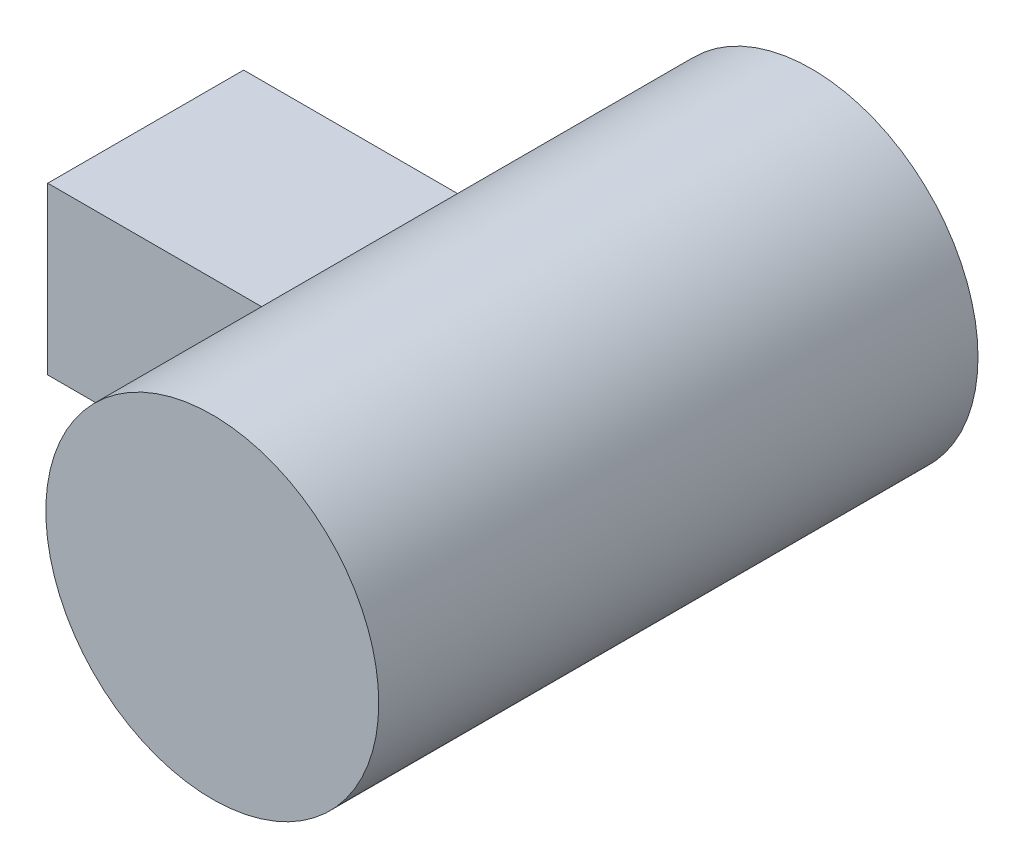
ISO-10303-21;
HEADER;
FILE_DESCRIPTION(('STEP AP214'),'2;1');
FILE_NAME('part.step','',(''),(''),'','','');
FILE_SCHEMA(('AUTOMOTIVE_DESIGN { 1 0 10303 214 1 1 1 1 }'));
ENDSEC;
DATA;
#1=APPLICATION_CONTEXT('core data for automotive mechanical design processes');
#2=APPLICATION_PROTOCOL_DEFINITION('international standard','automotive_design',2000,#1);
#3=PRODUCT_CONTEXT('',#1,'mechanical');
#4=PRODUCT('Part','Part','',(#3));
#5=PRODUCT_RELATED_PRODUCT_CATEGORY('part','',(#4));
#6=PRODUCT_DEFINITION_FORMATION('','',#4);
#7=PRODUCT_DEFINITION_CONTEXT('part definition',#1,'design');
#8=PRODUCT_DEFINITION('design','',#6,#7);
#9=PRODUCT_DEFINITION_SHAPE('','',#8);
#10=(LENGTH_UNIT() NAMED_UNIT(*) SI_UNIT(.MILLI.,.METRE.));
#11=(NAMED_UNIT(*) PLANE_ANGLE_UNIT() SI_UNIT($,.RADIAN.));
#12=(NAMED_UNIT(*) SI_UNIT($,.STERADIAN.) SOLID_ANGLE_UNIT());
#13=UNCERTAINTY_MEASURE_WITH_UNIT(LENGTH_MEASURE(1.E-05),#10,'distance_accuracy_value','');
#14=(GEOMETRIC_REPRESENTATION_CONTEXT(3) GLOBAL_UNCERTAINTY_ASSIGNED_CONTEXT((#13)) GLOBAL_UNIT_ASSIGNED_CONTEXT((#10,
#11,#12)) REPRESENTATION_CONTEXT('',''));
#15=CARTESIAN_POINT('',(0.,0.,0.));
#16=DIRECTION('',(0.,0.,1.));
#17=DIRECTION('',(1.,0.,0.));
#18=AXIS2_PLACEMENT_3D('',#15,#16,#17);
#19=CARTESIAN_POINT('',(0.,0.,57.15));
#20=DIRECTION('',(0.,0.,-1.));
#21=DIRECTION('',(-1.,0.,0.));
#22=AXIS2_PLACEMENT_3D('',#19,#20,#21);
#23=CYLINDRICAL_SURFACE('',#22,31.75);
#24=DIRECTION('',(0.,0.,-1.));
#25=VECTOR('',#24,1.);
#26=CARTESIAN_POINT('',(-27.5157989764262,15.8411901916777,57.15));
#27=LINE('',#26,#25);
#28=CARTESIAN_POINT('',(-27.5157989764262,15.8411901916777,-18.6844807389019));
#29=VERTEX_POINT('',#28);
#30=CARTESIAN_POINT('',(-27.5157989764262,15.8411901916777,18.6844807389019));
#31=VERTEX_POINT('',#30);
#32=EDGE_CURVE('E47',#29,#31,#27,.F.);
#33=ORIENTED_EDGE('',*,*,#32,.T.);
#34=CARTESIAN_POINT('',(0.,0.,18.6844807389019));
#35=DIRECTION('',(0.,0.,1.));
#36=DIRECTION('',(1.,0.,0.));
#37=AXIS2_PLACEMENT_3D('',#34,#35,#36);
#38=CIRCLE('',#37,31.75);
#39=CARTESIAN_POINT('',(-27.5157989764262,-15.8411901916777,18.6844807389019));
#40=VERTEX_POINT('',#39);
#41=EDGE_CURVE('E11',#31,#40,#38,.T.);
#42=ORIENTED_EDGE('',*,*,#41,.T.);
#43=DIRECTION('',(0.,0.,-1.));
#44=VECTOR('',#43,1.);
#45=CARTESIAN_POINT('',(-27.5157989764262,-15.8411901916777,57.15));
#46=LINE('',#45,#44);
#47=CARTESIAN_POINT('',(-27.5157989764262,-15.8411901916777,-18.6844807389019));
#48=VERTEX_POINT('',#47);
#49=EDGE_CURVE('E81',#40,#48,#46,.T.);
#50=ORIENTED_EDGE('',*,*,#49,.T.);
#51=CARTESIAN_POINT('',(0.,0.,-18.6844807389019));
#52=DIRECTION('',(0.,0.,-1.));
#53=DIRECTION('',(-1.,0.,0.));
#54=AXIS2_PLACEMENT_3D('',#51,#52,#53);
#55=CIRCLE('',#54,31.75);
#56=EDGE_CURVE('E113',#48,#29,#55,.T.);
#57=ORIENTED_EDGE('',*,*,#56,.T.);
#58=EDGE_LOOP('',(#33,#42,#50,#57));
#59=FACE_BOUND('',#58,.T.);
#60=CARTESIAN_POINT('',(0.,0.,57.15));
#61=DIRECTION('',(0.,0.,1.));
#62=DIRECTION('',(1.,0.,0.));
#63=AXIS2_PLACEMENT_3D('',#60,#61,#62);
#64=CIRCLE('',#63,31.75);
#65=CARTESIAN_POINT('',(31.75,0.,57.15));
#66=VERTEX_POINT('',#65);
#67=EDGE_CURVE('E107',#66,#66,#64,.T.);
#68=ORIENTED_EDGE('',*,*,#67,.F.);
#69=EDGE_LOOP('',(#68));
#70=FACE_BOUND('',#69,.T.);
#71=CARTESIAN_POINT('',(0.,0.,-57.15));
#72=DIRECTION('',(0.,0.,1.));
#73=DIRECTION('',(1.,0.,0.));
#74=AXIS2_PLACEMENT_3D('',#71,#72,#73);
#75=CIRCLE('',#74,31.75);
#76=CARTESIAN_POINT('',(31.75,0.,-57.15));
#77=VERTEX_POINT('',#76);
#78=EDGE_CURVE('E102',#77,#77,#75,.T.);
#79=ORIENTED_EDGE('',*,*,#78,.T.);
#80=EDGE_LOOP('',(#79));
#81=FACE_BOUND('',#80,.T.);
#82=ADVANCED_FACE('F40',(#59,#70,#81),#23,.T.);
#83=CARTESIAN_POINT('',(0.,0.,57.15));
#84=DIRECTION('',(0.,0.,1.));
#85=DIRECTION('',(1.,0.,0.));
#86=AXIS2_PLACEMENT_3D('',#83,#84,#85);
#87=PLANE('',#86);
#88=ORIENTED_EDGE('',*,*,#67,.T.);
#89=EDGE_LOOP('',(#88));
#90=FACE_BOUND('',#89,.T.);
#91=ADVANCED_FACE('F133',(#90),#87,.T.);
#92=CARTESIAN_POINT('',(0.,0.,-57.15));
#93=DIRECTION('',(0.,0.,1.));
#94=DIRECTION('',(1.,0.,0.));
#95=AXIS2_PLACEMENT_3D('',#92,#93,#94);
#96=PLANE('',#95);
#97=ORIENTED_EDGE('',*,*,#78,.F.);
#98=EDGE_LOOP('',(#97));
#99=FACE_BOUND('',#98,.T.);
#100=ADVANCED_FACE('F137',(#99),#96,.F.);
#101=CARTESIAN_POINT('',(-69.85,15.8411901916777,-18.6844807389019));
#102=DIRECTION('',(0.,1.,0.));
#103=DIRECTION('',(0.,0.,1.));
#104=AXIS2_PLACEMENT_3D('',#101,#102,#103);
#105=PLANE('',#104);
#106=ORIENTED_EDGE('',*,*,#32,.F.);
#107=DIRECTION('',(1.,0.,0.));
#108=VECTOR('',#107,1.);
#109=CARTESIAN_POINT('',(-69.85,15.8411901916777,-18.6844807389019));
#110=LINE('',#109,#108);
#111=CARTESIAN_POINT('',(-69.85,15.8411901916777,-18.6844807389019));
#112=VERTEX_POINT('',#111);
#113=EDGE_CURVE('E103',#112,#29,#110,.T.);
#114=ORIENTED_EDGE('',*,*,#113,.F.);
#115=DIRECTION('',(0.,0.,1.));
#116=VECTOR('',#115,1.);
#117=CARTESIAN_POINT('',(-69.85,15.8411901916777,-18.6844807389019));
#118=LINE('',#117,#116);
#119=CARTESIAN_POINT('',(-69.85,15.8411901916777,18.6844807389019));
#120=VERTEX_POINT('',#119);
#121=EDGE_CURVE('E83',#112,#120,#118,.T.);
#122=ORIENTED_EDGE('',*,*,#121,.T.);
#123=DIRECTION('',(1.,0.,0.));
#124=VECTOR('',#123,1.);
#125=CARTESIAN_POINT('',(-69.85,15.8411901916777,18.6844807389019));
#126=LINE('',#125,#124);
#127=EDGE_CURVE('E96',#120,#31,#126,.T.);
#128=ORIENTED_EDGE('',*,*,#127,.T.);
#129=EDGE_LOOP('',(#106,#114,#122,#128));
#130=FACE_BOUND('',#129,.T.);
#131=ADVANCED_FACE('F119',(#130),#105,.T.);
#132=CARTESIAN_POINT('',(-69.85,-15.8411901916777,-18.6844807389019));
#133=DIRECTION('',(0.,-1.,0.));
#134=DIRECTION('',(0.,0.,-1.));
#135=AXIS2_PLACEMENT_3D('',#132,#133,#134);
#136=PLANE('',#135);
#137=ORIENTED_EDGE('',*,*,#49,.F.);
#138=DIRECTION('',(1.,0.,0.));
#139=VECTOR('',#138,1.);
#140=CARTESIAN_POINT('',(-69.85,-15.8411901916777,18.6844807389019));
#141=LINE('',#140,#139);
#142=CARTESIAN_POINT('',(-69.85,-15.8411901916777,18.6844807389019));
#143=VERTEX_POINT('',#142);
#144=EDGE_CURVE('E76',#143,#40,#141,.T.);
#145=ORIENTED_EDGE('',*,*,#144,.F.);
#146=DIRECTION('',(0.,0.,-1.));
#147=VECTOR('',#146,1.);
#148=CARTESIAN_POINT('',(-69.85,-15.8411901916777,-18.6844807389019));
#149=LINE('',#148,#147);
#150=CARTESIAN_POINT('',(-69.85,-15.8411901916777,-18.6844807389019));
#151=VERTEX_POINT('',#150);
#152=EDGE_CURVE('E79',#143,#151,#149,.T.);
#153=ORIENTED_EDGE('',*,*,#152,.T.);
#154=DIRECTION('',(1.,0.,0.));
#155=VECTOR('',#154,1.);
#156=CARTESIAN_POINT('',(-69.85,-15.8411901916777,-18.6844807389019));
#157=LINE('',#156,#155);
#158=EDGE_CURVE('E54',#151,#48,#157,.T.);
#159=ORIENTED_EDGE('',*,*,#158,.T.);
#160=EDGE_LOOP('',(#137,#145,#153,#159));
#161=FACE_BOUND('',#160,.T.);
#162=ADVANCED_FACE('F78',(#161),#136,.T.);
#163=CARTESIAN_POINT('',(-69.85,-15.8411901916777,18.6844807389019));
#164=DIRECTION('',(0.,0.,1.));
#165=DIRECTION('',(1.,0.,0.));
#166=AXIS2_PLACEMENT_3D('',#163,#164,#165);
#167=PLANE('',#166);
#168=ORIENTED_EDGE('',*,*,#41,.F.);
#169=ORIENTED_EDGE('',*,*,#127,.F.);
#170=DIRECTION('',(0.,-1.,0.));
#171=VECTOR('',#170,1.);
#172=CARTESIAN_POINT('',(-69.85,-15.8411901916777,18.6844807389019));
#173=LINE('',#172,#171);
#174=EDGE_CURVE('E90',#120,#143,#173,.T.);
#175=ORIENTED_EDGE('',*,*,#174,.T.);
#176=ORIENTED_EDGE('',*,*,#144,.T.);
#177=EDGE_LOOP('',(#168,#169,#175,#176));
#178=FACE_BOUND('',#177,.T.);
#179=ADVANCED_FACE('F95',(#178),#167,.T.);
#180=CARTESIAN_POINT('',(-69.85,-15.8411901916777,-18.6844807389019));
#181=DIRECTION('',(0.,0.,-1.));
#182=DIRECTION('',(-1.,0.,0.));
#183=AXIS2_PLACEMENT_3D('',#180,#181,#182);
#184=PLANE('',#183);
#185=ORIENTED_EDGE('',*,*,#56,.F.);
#186=ORIENTED_EDGE('',*,*,#158,.F.);
#187=DIRECTION('',(0.,1.,0.));
#188=VECTOR('',#187,1.);
#189=CARTESIAN_POINT('',(-69.85,-15.8411901916777,-18.6844807389019));
#190=LINE('',#189,#188);
#191=EDGE_CURVE('E93',#151,#112,#190,.T.);
#192=ORIENTED_EDGE('',*,*,#191,.T.);
#193=ORIENTED_EDGE('',*,*,#113,.T.);
#194=EDGE_LOOP('',(#185,#186,#192,#193));
#195=FACE_BOUND('',#194,.T.);
#196=ADVANCED_FACE('F121',(#195),#184,.T.);
#197=CARTESIAN_POINT('',(-69.85,0.,0.));
#198=DIRECTION('',(1.,0.,0.));
#199=DIRECTION('',(0.,0.,-1.));
#200=AXIS2_PLACEMENT_3D('',#197,#198,#199);
#201=PLANE('',#200);
#202=ORIENTED_EDGE('',*,*,#174,.F.);
#203=ORIENTED_EDGE('',*,*,#121,.F.);
#204=ORIENTED_EDGE('',*,*,#191,.F.);
#205=ORIENTED_EDGE('',*,*,#152,.F.);
#206=EDGE_LOOP('',(#202,#203,#204,#205));
#207=FACE_BOUND('',#206,.T.);
#208=ADVANCED_FACE('F88',(#207),#201,.F.);
#209=CLOSED_SHELL('',(#82,#91,#100,#131,#162,#179,#196,#208));
#210=MANIFOLD_SOLID_BREP('B2',#209);
#211=ADVANCED_BREP_SHAPE_REPRESENTATION('',(#18,#210),#14);
#212=SHAPE_DEFINITION_REPRESENTATION(#9,#211);
ENDSEC;
END-ISO-10303-21;
